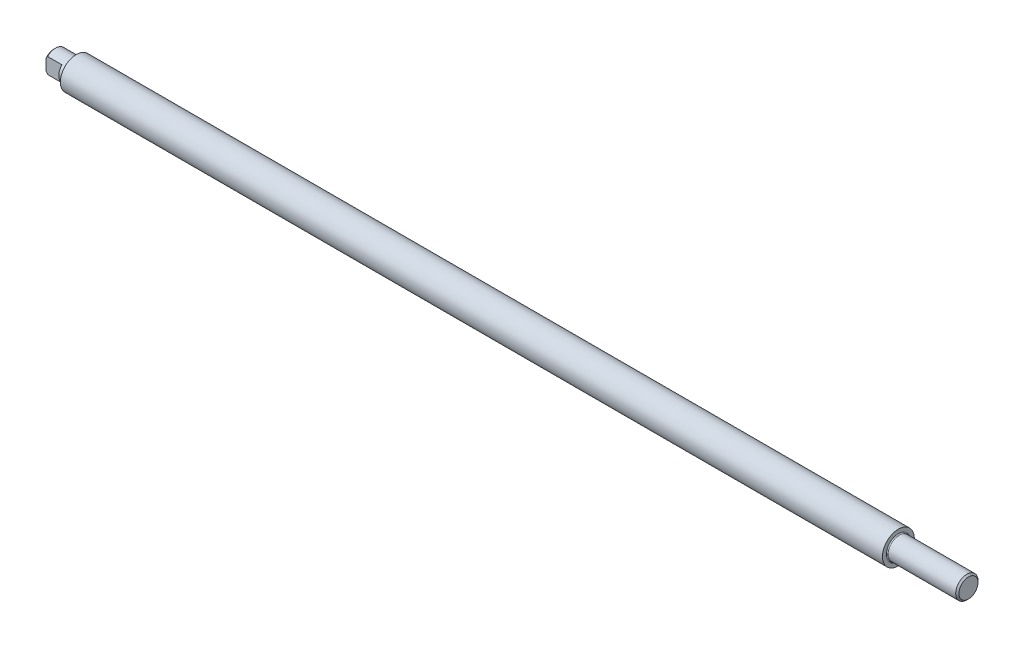
ISO-10303-21;
HEADER;
FILE_DESCRIPTION(('STEP AP214'),'2;1');
FILE_NAME('part.step','',(''),(''),'','','');
FILE_SCHEMA(('AUTOMOTIVE_DESIGN { 1 0 10303 214 1 1 1 1 }'));
ENDSEC;
DATA;
#1=APPLICATION_CONTEXT('core data for automotive mechanical design processes');
#2=APPLICATION_PROTOCOL_DEFINITION('international standard','automotive_design',2000,#1);
#3=PRODUCT_CONTEXT('',#1,'mechanical');
#4=PRODUCT('Part','Part','',(#3));
#5=PRODUCT_RELATED_PRODUCT_CATEGORY('part','',(#4));
#6=PRODUCT_DEFINITION_FORMATION('','',#4);
#7=PRODUCT_DEFINITION_CONTEXT('part definition',#1,'design');
#8=PRODUCT_DEFINITION('design','',#6,#7);
#9=PRODUCT_DEFINITION_SHAPE('','',#8);
#10=(LENGTH_UNIT() NAMED_UNIT(*) SI_UNIT(.MILLI.,.METRE.));
#11=(NAMED_UNIT(*) PLANE_ANGLE_UNIT() SI_UNIT($,.RADIAN.));
#12=(NAMED_UNIT(*) SI_UNIT($,.STERADIAN.) SOLID_ANGLE_UNIT());
#13=UNCERTAINTY_MEASURE_WITH_UNIT(LENGTH_MEASURE(1.E-05),#10,'distance_accuracy_value','');
#14=(GEOMETRIC_REPRESENTATION_CONTEXT(3) GLOBAL_UNCERTAINTY_ASSIGNED_CONTEXT((#13)) GLOBAL_UNIT_ASSIGNED_CONTEXT((#10,
#11,#12)) REPRESENTATION_CONTEXT('',''));
#15=CARTESIAN_POINT('',(0.,0.,0.));
#16=DIRECTION('',(0.,0.,1.));
#17=DIRECTION('',(1.,0.,0.));
#18=AXIS2_PLACEMENT_3D('',#15,#16,#17);
#19=CARTESIAN_POINT('',(287.,3.,3.03600212064401));
#20=DIRECTION('',(1.,0.,0.));
#21=DIRECTION('',(0.,-1.,0.));
#22=AXIS2_PLACEMENT_3D('',#19,#20,#21);
#23=PLANE('',#22);
#24=CARTESIAN_POINT('',(287.,0.,0.));
#25=DIRECTION('',(-1.,0.,0.));
#26=DIRECTION('',(0.,0.,1.));
#27=AXIS2_PLACEMENT_3D('',#24,#25,#26);
#28=CIRCLE('',#27,2.99999999999999);
#29=CARTESIAN_POINT('',(287.,0.,2.99999999999999));
#30=VERTEX_POINT('',#29);
#31=EDGE_CURVE('E89',#30,#30,#28,.T.);
#32=ORIENTED_EDGE('',*,*,#31,.F.);
#33=EDGE_LOOP('',(#32));
#34=FACE_BOUND('',#33,.T.);
#35=ADVANCED_FACE('F16',(#34),#23,.T.);
#36=CARTESIAN_POINT('',(0.,-3.,2.5));
#37=DIRECTION('',(-1.,0.,0.));
#38=DIRECTION('',(0.,1.,0.));
#39=AXIS2_PLACEMENT_3D('',#36,#37,#38);
#40=PLANE('',#39);
#41=CARTESIAN_POINT('',(0.,0.,0.));
#42=DIRECTION('',(1.,0.,0.));
#43=DIRECTION('',(0.,0.,-1.));
#44=AXIS2_PLACEMENT_3D('',#41,#42,#43);
#45=CIRCLE('',#44,3.);
#46=CARTESIAN_POINT('',(0.,-1.6583123951777,2.5));
#47=VERTEX_POINT('',#46);
#48=CARTESIAN_POINT('',(0.,1.6583123951777,2.5));
#49=VERTEX_POINT('',#48);
#50=EDGE_CURVE('E84',#47,#49,#45,.T.);
#51=ORIENTED_EDGE('',*,*,#50,.F.);
#52=DIRECTION('',(0.,-1.,0.));
#53=VECTOR('',#52,1.);
#54=CARTESIAN_POINT('',(0.,0.,2.5));
#55=LINE('',#54,#53);
#56=EDGE_CURVE('E88',#49,#47,#55,.T.);
#57=ORIENTED_EDGE('',*,*,#56,.F.);
#58=EDGE_LOOP('',(#51,#57));
#59=FACE_BOUND('',#58,.T.);
#60=ADVANCED_FACE('F134',(#59),#40,.T.);
#61=CARTESIAN_POINT('',(287.,0.,0.));
#62=DIRECTION('',(-1.,0.,0.));
#63=DIRECTION('',(0.,0.,1.));
#64=AXIS2_PLACEMENT_3D('',#61,#62,#63);
#65=CONICAL_SURFACE('',#64,2.99999999999999,0.785398163397438);
#66=CARTESIAN_POINT('',(286.5,0.,0.));
#67=DIRECTION('',(-1.,0.,0.));
#68=DIRECTION('',(0.,1.,0.));
#69=AXIS2_PLACEMENT_3D('',#66,#67,#68);
#70=CIRCLE('',#69,3.49999999999999);
#71=CARTESIAN_POINT('',(286.5,3.49999999999999,0.));
#72=VERTEX_POINT('',#71);
#73=EDGE_CURVE('E95',#72,#72,#70,.T.);
#74=ORIENTED_EDGE('',*,*,#73,.F.);
#75=EDGE_LOOP('',(#74));
#76=FACE_BOUND('',#75,.T.);
#77=ORIENTED_EDGE('',*,*,#31,.T.);
#78=EDGE_LOOP('',(#77));
#79=FACE_BOUND('',#78,.T.);
#80=ADVANCED_FACE('F131',(#76,#79),#65,.T.);
#81=CARTESIAN_POINT('',(5.,-2.44948974278318,2.5));
#82=CARTESIAN_POINT('',(5.,-2.44948974278318,3.5));
#83=CARTESIAN_POINT('',(5.,-2.44948974278318,3.51));
#84=CARTESIAN_POINT('',(5.,-2.44948974278318,3.52226751962325));
#85=B_SPLINE_CURVE_WITH_KNOTS('',1,(#81,#82,#83,#84),.UNSPECIFIED.,.F.,.F.,(2,1,1,2),(0.,1.,
1.01,1.02226751962325),.UNSPECIFIED.);
#86=DIRECTION('',(0.,1.,0.));
#87=VECTOR('',#86,1.);
#88=SURFACE_OF_LINEAR_EXTRUSION('',#85,#87);
#89=CARTESIAN_POINT('',(5.,0.,0.));
#90=DIRECTION('',(-1.,0.,0.));
#91=DIRECTION('',(0.,0.,1.));
#92=AXIS2_PLACEMENT_3D('',#89,#90,#91);
#93=CIRCLE('',#92,3.5);
#94=CARTESIAN_POINT('',(5.,2.44948974278318,2.5));
#95=VERTEX_POINT('',#94);
#96=CARTESIAN_POINT('',(5.,-2.44948974278318,2.5));
#97=VERTEX_POINT('',#96);
#98=EDGE_CURVE('E94',#95,#97,#93,.F.);
#99=ORIENTED_EDGE('',*,*,#98,.F.);
#100=DIRECTION('',(0.,1.,0.));
#101=VECTOR('',#100,1.);
#102=CARTESIAN_POINT('',(5.,0.,2.5));
#103=LINE('',#102,#101);
#104=EDGE_CURVE('E92',#97,#95,#103,.T.);
#105=ORIENTED_EDGE('',*,*,#104,.F.);
#106=EDGE_LOOP('',(#99,#105));
#107=FACE_BOUND('',#106,.T.);
#108=ADVANCED_FACE('F127',(#107),#88,.T.);
#109=CARTESIAN_POINT('',(0.,2.44948974278318,2.5));
#110=DIRECTION('',(0.,0.,1.));
#111=DIRECTION('',(0.,-1.,0.));
#112=AXIS2_PLACEMENT_3D('',#109,#110,#111);
#113=PLANE('',#112);
#114=ORIENTED_EDGE('',*,*,#104,.T.);
#115=DIRECTION('',(1.,0.,0.));
#116=VECTOR('',#115,1.);
#117=CARTESIAN_POINT('',(3.6,2.44948974278318,2.5));
#118=LINE('',#117,#116);
#119=CARTESIAN_POINT('',(0.5,2.44948974278318,2.5));
#120=VERTEX_POINT('',#119);
#121=EDGE_CURVE('E72',#120,#95,#118,.T.);
#122=ORIENTED_EDGE('',*,*,#121,.F.);
#123=CARTESIAN_POINT('',(0.5,2.44948974278318,2.5));
#124=CARTESIAN_POINT('',(0.455256526270824,2.38554251126744,2.5));
#125=CARTESIAN_POINT('',(0.41109621526617,2.32118009299519,2.5));
#126=CARTESIAN_POINT('',(0.324234143708846,2.19154358813011,2.5));
#127=CARTESIAN_POINT('',(0.281531404896012,2.12627015614058,2.5));
#128=CARTESIAN_POINT('',(0.197807919050685,1.99463242410213,2.5));
#129=CARTESIAN_POINT('',(0.156787445381831,1.92826794919684,2.5));
#130=CARTESIAN_POINT('',(0.0767732564822045,1.79426868492111,2.5));
#131=CARTESIAN_POINT('',(0.0377809523447436,1.72663305453461,2.5));
#132=CARTESIAN_POINT('',(0.,1.6583123951777,2.5));
#133=B_SPLINE_CURVE_WITH_KNOTS('',3,(#123,#124,#125,#126,#127,#128,#129,#130,#131,#132),
.UNSPECIFIED.,.F.,.F.,(4,2,2,2,4),(0.,0.234143987034239,0.468127606501736,0.70214909824001,
0.936331289706144),.UNSPECIFIED.);
#134=EDGE_CURVE('E82',#120,#49,#133,.T.);
#135=ORIENTED_EDGE('',*,*,#134,.T.);
#136=ORIENTED_EDGE('',*,*,#56,.T.);
#137=CARTESIAN_POINT('',(0.5,-2.44948974278318,2.5));
#138=CARTESIAN_POINT('',(0.455256526270824,-2.38554251126744,2.5));
#139=CARTESIAN_POINT('',(0.411096215266169,-2.32118009299519,2.5));
#140=CARTESIAN_POINT('',(0.324234143708845,-2.19154358813011,2.5));
#141=CARTESIAN_POINT('',(0.281531404896012,-2.12627015614058,2.5));
#142=CARTESIAN_POINT('',(0.197807919050684,-1.99463242410213,2.5));
#143=CARTESIAN_POINT('',(0.15678744538183,-1.92826794919684,2.5));
#144=CARTESIAN_POINT('',(0.0767732564822043,-1.79426868492111,2.5));
#145=CARTESIAN_POINT('',(0.0377809523447435,-1.72663305453461,2.5));
#146=CARTESIAN_POINT('',(0.,-1.6583123951777,2.5));
#147=B_SPLINE_CURVE_WITH_KNOTS('',3,(#137,#138,#139,#140,#141,#142,#143,#144,#145,#146),
.UNSPECIFIED.,.F.,.F.,(4,2,2,2,4),(0.,0.234143987034239,0.468127606501736,0.702149098240009,
0.936331289706143),.UNSPECIFIED.);
#148=CARTESIAN_POINT('',(0.5,-2.44948974278318,2.5));
#149=VERTEX_POINT('',#148);
#150=EDGE_CURVE('E107',#149,#47,#147,.T.);
#151=ORIENTED_EDGE('',*,*,#150,.F.);
#152=DIRECTION('',(-1.,0.,0.));
#153=VECTOR('',#152,1.);
#154=CARTESIAN_POINT('',(3.6,-2.44948974278318,2.5));
#155=LINE('',#154,#153);
#156=EDGE_CURVE('E74',#97,#149,#155,.T.);
#157=ORIENTED_EDGE('',*,*,#156,.F.);
#158=EDGE_LOOP('',(#114,#122,#135,#136,#151,#157));
#159=FACE_BOUND('',#158,.T.);
#160=ADVANCED_FACE('F91',(#159),#113,.T.);
#161=CARTESIAN_POINT('',(0.,0.,0.));
#162=DIRECTION('',(1.,0.,0.));
#163=DIRECTION('',(0.,0.,-1.));
#164=AXIS2_PLACEMENT_3D('',#161,#162,#163);
#165=CONICAL_SURFACE('',#164,3.,0.785398163397448);
#166=CARTESIAN_POINT('',(0.5,0.,0.));
#167=DIRECTION('',(-1.,0.,0.));
#168=DIRECTION('',(0.,1.,0.));
#169=AXIS2_PLACEMENT_3D('',#166,#167,#168);
#170=CIRCLE('',#169,3.5);
#171=EDGE_CURVE('E67',#149,#120,#170,.F.);
#172=ORIENTED_EDGE('',*,*,#171,.F.);
#173=ORIENTED_EDGE('',*,*,#150,.T.);
#174=ORIENTED_EDGE('',*,*,#50,.T.);
#175=ORIENTED_EDGE('',*,*,#134,.F.);
#176=EDGE_LOOP('',(#172,#173,#174,#175));
#177=FACE_BOUND('',#176,.T.);
#178=ADVANCED_FACE('F83',(#177),#165,.T.);
#179=CARTESIAN_POINT('',(265.3,0.,0.));
#180=DIRECTION('',(-1.,0.,0.));
#181=DIRECTION('',(0.,0.,1.));
#182=AXIS2_PLACEMENT_3D('',#179,#180,#181);
#183=CYLINDRICAL_SURFACE('',#182,3.49999999999999);
#184=CARTESIAN_POINT('',(265.3,0.,0.));
#185=DIRECTION('',(-1.,0.,0.));
#186=DIRECTION('',(0.,0.,1.));
#187=AXIS2_PLACEMENT_3D('',#184,#185,#186);
#188=CIRCLE('',#187,3.49999999999999);
#189=CARTESIAN_POINT('',(265.3,0.,3.49999999999999));
#190=VERTEX_POINT('',#189);
#191=EDGE_CURVE('E78',#190,#190,#188,.T.);
#192=ORIENTED_EDGE('',*,*,#191,.F.);
#193=EDGE_LOOP('',(#192));
#194=FACE_BOUND('',#193,.T.);
#195=ORIENTED_EDGE('',*,*,#73,.T.);
#196=EDGE_LOOP('',(#195));
#197=FACE_BOUND('',#196,.T.);
#198=ADVANCED_FACE('F328',(#194,#197),#183,.T.);
#199=CARTESIAN_POINT('',(0.5,0.,0.));
#200=DIRECTION('',(-1.,0.,0.));
#201=DIRECTION('',(0.,0.,1.));
#202=AXIS2_PLACEMENT_3D('',#199,#200,#201);
#203=CYLINDRICAL_SURFACE('',#202,3.5);
#204=CARTESIAN_POINT('',(6.7,0.,0.));
#205=DIRECTION('',(-1.,0.,0.));
#206=DIRECTION('',(0.,0.,1.));
#207=AXIS2_PLACEMENT_3D('',#204,#205,#206);
#208=CIRCLE('',#207,3.5);
#209=CARTESIAN_POINT('',(6.7,0.,3.5));
#210=VERTEX_POINT('',#209);
#211=EDGE_CURVE('E200',#210,#210,#208,.F.);
#212=ORIENTED_EDGE('',*,*,#211,.F.);
#213=EDGE_LOOP('',(#212));
#214=FACE_BOUND('',#213,.T.);
#215=ORIENTED_EDGE('',*,*,#171,.T.);
#216=ORIENTED_EDGE('',*,*,#121,.T.);
#217=ORIENTED_EDGE('',*,*,#98,.T.);
#218=ORIENTED_EDGE('',*,*,#156,.T.);
#219=EDGE_LOOP('',(#215,#216,#217,#218));
#220=FACE_BOUND('',#219,.T.);
#221=ADVANCED_FACE('F69',(#214,#220),#203,.T.);
#222=CARTESIAN_POINT('',(265.3,0.,0.));
#223=DIRECTION('',(-1.,0.,0.));
#224=DIRECTION('',(0.,0.,1.));
#225=AXIS2_PLACEMENT_3D('',#222,#223,#224);
#226=TOROIDAL_SURFACE('',#225,3.79999999999989,0.2999999999999);
#227=ORIENTED_EDGE('',*,*,#191,.T.);
#228=EDGE_LOOP('',(#227));
#229=FACE_BOUND('',#228,.T.);
#230=CARTESIAN_POINT('',(265.,0.,0.));
#231=DIRECTION('',(1.,0.,0.));
#232=DIRECTION('',(0.,0.,1.));
#233=AXIS2_PLACEMENT_3D('',#230,#231,#232);
#234=CIRCLE('',#233,3.79999999999989);
#235=CARTESIAN_POINT('',(265.,0.,-3.79999999999989));
#236=VERTEX_POINT('',#235);
#237=CARTESIAN_POINT('',(265.,0.,3.79999999999989));
#238=VERTEX_POINT('',#237);
#239=EDGE_CURVE('E190',#236,#238,#234,.F.);
#240=ORIENTED_EDGE('',*,*,#239,.F.);
#241=CARTESIAN_POINT('',(265.,0.,0.));
#242=DIRECTION('',(1.,0.,0.));
#243=DIRECTION('',(0.,0.,-1.));
#244=AXIS2_PLACEMENT_3D('',#241,#242,#243);
#245=CIRCLE('',#244,3.79999999999989);
#246=CARTESIAN_POINT('',(265.,3.79999999999989,0.));
#247=VERTEX_POINT('',#246);
#248=EDGE_CURVE('E192',#247,#236,#245,.F.);
#249=ORIENTED_EDGE('',*,*,#248,.F.);
#250=CARTESIAN_POINT('',(265.,0.,0.));
#251=DIRECTION('',(1.,0.,0.));
#252=DIRECTION('',(0.,1.,0.));
#253=AXIS2_PLACEMENT_3D('',#250,#251,#252);
#254=CIRCLE('',#253,3.79999999999989);
#255=EDGE_CURVE('E197',#238,#247,#254,.F.);
#256=ORIENTED_EDGE('',*,*,#255,.F.);
#257=EDGE_LOOP('',(#240,#249,#256));
#258=FACE_BOUND('',#257,.T.);
#259=ADVANCED_FACE('F237',(#229,#258),#226,.F.);
#260=CARTESIAN_POINT('',(6.7,0.,0.));
#261=DIRECTION('',(-1.,0.,0.));
#262=DIRECTION('',(0.,0.,1.));
#263=AXIS2_PLACEMENT_3D('',#260,#261,#262);
#264=TOROIDAL_SURFACE('',#263,3.8,0.3);
#265=CARTESIAN_POINT('',(7.,0.,0.));
#266=DIRECTION('',(-1.,0.,0.));
#267=DIRECTION('',(0.,1.,0.));
#268=AXIS2_PLACEMENT_3D('',#265,#266,#267);
#269=CIRCLE('',#268,3.8);
#270=CARTESIAN_POINT('',(7.,0.,-3.8));
#271=VERTEX_POINT('',#270);
#272=CARTESIAN_POINT('',(7.,3.8,0.));
#273=VERTEX_POINT('',#272);
#274=EDGE_CURVE('E187',#271,#273,#269,.F.);
#275=ORIENTED_EDGE('',*,*,#274,.F.);
#276=CARTESIAN_POINT('',(7.,0.,0.));
#277=DIRECTION('',(-1.,0.,0.));
#278=DIRECTION('',(0.,0.,-1.));
#279=AXIS2_PLACEMENT_3D('',#276,#277,#278);
#280=CIRCLE('',#279,3.8);
#281=CARTESIAN_POINT('',(7.,0.,3.8));
#282=VERTEX_POINT('',#281);
#283=EDGE_CURVE('E36',#282,#271,#280,.F.);
#284=ORIENTED_EDGE('',*,*,#283,.F.);
#285=CARTESIAN_POINT('',(7.,0.,0.));
#286=DIRECTION('',(-1.,0.,0.));
#287=DIRECTION('',(0.,0.,1.));
#288=AXIS2_PLACEMENT_3D('',#285,#286,#287);
#289=CIRCLE('',#288,3.8);
#290=EDGE_CURVE('E179',#273,#282,#289,.F.);
#291=ORIENTED_EDGE('',*,*,#290,.F.);
#292=EDGE_LOOP('',(#275,#284,#291));
#293=FACE_BOUND('',#292,.T.);
#294=ORIENTED_EDGE('',*,*,#211,.T.);
#295=EDGE_LOOP('',(#294));
#296=FACE_BOUND('',#295,.T.);
#297=ADVANCED_FACE('F246',(#293,#296),#264,.F.);
#298=CARTESIAN_POINT('',(265.,5.,5.06000210822763));
#299=DIRECTION('',(1.,0.,0.));
#300=DIRECTION('',(0.,-1.,0.));
#301=AXIS2_PLACEMENT_3D('',#298,#299,#300);
#302=PLANE('',#301);
#303=ORIENTED_EDGE('',*,*,#248,.T.);
#304=ORIENTED_EDGE('',*,*,#239,.T.);
#305=ORIENTED_EDGE('',*,*,#255,.T.);
#306=EDGE_LOOP('',(#303,#304,#305));
#307=FACE_BOUND('',#306,.T.);
#308=CARTESIAN_POINT('',(265.,0.,0.));
#309=DIRECTION('',(-1.,0.,0.));
#310=DIRECTION('',(0.,0.,1.));
#311=AXIS2_PLACEMENT_3D('',#308,#309,#310);
#312=CIRCLE('',#311,5.);
#313=CARTESIAN_POINT('',(265.,0.,4.99999999999998));
#314=VERTEX_POINT('',#313);
#315=EDGE_CURVE('E27',#314,#314,#312,.T.);
#316=ORIENTED_EDGE('',*,*,#315,.F.);
#317=EDGE_LOOP('',(#316));
#318=FACE_BOUND('',#317,.T.);
#319=ADVANCED_FACE('F151',(#307,#318),#302,.T.);
#320=CARTESIAN_POINT('',(7.,-5.,5.06000210821955));
#321=DIRECTION('',(-1.,0.,0.));
#322=DIRECTION('',(0.,1.,0.));
#323=AXIS2_PLACEMENT_3D('',#320,#321,#322);
#324=PLANE('',#323);
#325=ORIENTED_EDGE('',*,*,#290,.T.);
#326=ORIENTED_EDGE('',*,*,#283,.T.);
#327=ORIENTED_EDGE('',*,*,#274,.T.);
#328=EDGE_LOOP('',(#325,#326,#327));
#329=FACE_BOUND('',#328,.T.);
#330=CARTESIAN_POINT('',(7.00000000000001,0.,0.));
#331=DIRECTION('',(-1.,0.,0.));
#332=DIRECTION('',(0.,0.,1.));
#333=AXIS2_PLACEMENT_3D('',#330,#331,#332);
#334=CIRCLE('',#333,5.);
#335=CARTESIAN_POINT('',(7.00000000000001,0.,5.));
#336=VERTEX_POINT('',#335);
#337=EDGE_CURVE('E10',#336,#336,#334,.F.);
#338=ORIENTED_EDGE('',*,*,#337,.F.);
#339=EDGE_LOOP('',(#338));
#340=FACE_BOUND('',#339,.T.);
#341=ADVANCED_FACE('F145',(#329,#340),#324,.T.);
#342=CARTESIAN_POINT('',(7.,0.,0.));
#343=DIRECTION('',(-1.,0.,0.));
#344=DIRECTION('',(0.,0.,1.));
#345=AXIS2_PLACEMENT_3D('',#342,#343,#344);
#346=CYLINDRICAL_SURFACE('',#345,5.);
#347=ORIENTED_EDGE('',*,*,#315,.T.);
#348=EDGE_LOOP('',(#347));
#349=FACE_BOUND('',#348,.T.);
#350=ORIENTED_EDGE('',*,*,#337,.T.);
#351=EDGE_LOOP('',(#350));
#352=FACE_BOUND('',#351,.T.);
#353=ADVANCED_FACE('F143',(#349,#352),#346,.T.);
#354=CLOSED_SHELL('',(#35,#60,#80,#108,#160,#178,#198,#221,#259,#297,#319,#341,#353));
#355=MANIFOLD_SOLID_BREP('B1',#354);
#356=ADVANCED_BREP_SHAPE_REPRESENTATION('',(#18,#355),#14);
#357=SHAPE_DEFINITION_REPRESENTATION(#9,#356);
ENDSEC;
END-ISO-10303-21;
